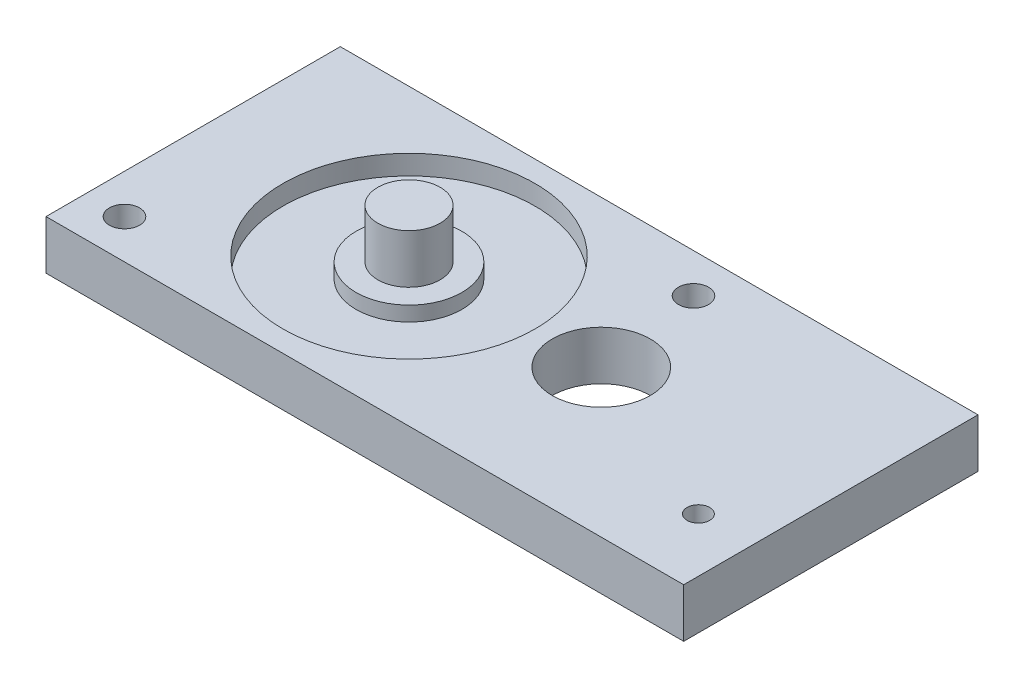
ISO-10303-21;
HEADER;
FILE_DESCRIPTION(('STEP AP214'),'2;1');
FILE_NAME('part.step','',(''),(''),'','','');
FILE_SCHEMA(('AUTOMOTIVE_DESIGN { 1 0 10303 214 1 1 1 1 }'));
ENDSEC;
DATA;
#1=APPLICATION_CONTEXT('core data for automotive mechanical design processes');
#2=APPLICATION_PROTOCOL_DEFINITION('international standard','automotive_design',2000,#1);
#3=PRODUCT_CONTEXT('',#1,'mechanical');
#4=PRODUCT('Part','Part','',(#3));
#5=PRODUCT_RELATED_PRODUCT_CATEGORY('part','',(#4));
#6=PRODUCT_DEFINITION_FORMATION('','',#4);
#7=PRODUCT_DEFINITION_CONTEXT('part definition',#1,'design');
#8=PRODUCT_DEFINITION('design','',#6,#7);
#9=PRODUCT_DEFINITION_SHAPE('','',#8);
#10=(LENGTH_UNIT() NAMED_UNIT(*) SI_UNIT(.MILLI.,.METRE.));
#11=(NAMED_UNIT(*) PLANE_ANGLE_UNIT() SI_UNIT($,.RADIAN.));
#12=(NAMED_UNIT(*) SI_UNIT($,.STERADIAN.) SOLID_ANGLE_UNIT());
#13=UNCERTAINTY_MEASURE_WITH_UNIT(LENGTH_MEASURE(1.E-05),#10,'distance_accuracy_value','');
#14=(GEOMETRIC_REPRESENTATION_CONTEXT(3) GLOBAL_UNCERTAINTY_ASSIGNED_CONTEXT((#13)) GLOBAL_UNIT_ASSIGNED_CONTEXT((#10,
#11,#12)) REPRESENTATION_CONTEXT('',''));
#15=CARTESIAN_POINT('',(0.,0.,0.));
#16=DIRECTION('',(0.,0.,1.));
#17=DIRECTION('',(1.,0.,0.));
#18=AXIS2_PLACEMENT_3D('',#15,#16,#17);
#19=CARTESIAN_POINT('',(0.,3.,0.));
#20=DIRECTION('',(0.,1.,0.));
#21=DIRECTION('',(0.,0.,1.));
#22=AXIS2_PLACEMENT_3D('',#19,#20,#21);
#23=CYLINDRICAL_SURFACE('',#22,5.4);
#24=CARTESIAN_POINT('',(0.,3.,0.));
#25=DIRECTION('',(0.,1.,0.));
#26=DIRECTION('',(0.,0.,1.));
#27=AXIS2_PLACEMENT_3D('',#24,#25,#26);
#28=CIRCLE('',#27,5.4);
#29=CARTESIAN_POINT('',(0.,3.,5.4));
#30=VERTEX_POINT('',#29);
#31=EDGE_CURVE('E120',#30,#30,#28,.T.);
#32=ORIENTED_EDGE('',*,*,#31,.T.);
#33=EDGE_LOOP('',(#32));
#34=FACE_BOUND('',#33,.T.);
#35=CARTESIAN_POINT('',(0.,4.5,0.));
#36=DIRECTION('',(0.,1.,0.));
#37=DIRECTION('',(0.,0.,1.));
#38=AXIS2_PLACEMENT_3D('',#35,#36,#37);
#39=CIRCLE('',#38,5.4);
#40=CARTESIAN_POINT('',(0.,4.5,5.4));
#41=VERTEX_POINT('',#40);
#42=EDGE_CURVE('E105',#41,#41,#39,.T.);
#43=ORIENTED_EDGE('',*,*,#42,.F.);
#44=EDGE_LOOP('',(#43));
#45=FACE_BOUND('',#44,.T.);
#46=ADVANCED_FACE('F38',(#34,#45),#23,.T.);
#47=CARTESIAN_POINT('',(-22.,5.,-15.));
#48=DIRECTION('',(1.,0.,0.));
#49=DIRECTION('',(0.,0.,-1.));
#50=AXIS2_PLACEMENT_3D('',#47,#48,#49);
#51=PLANE('',#50);
#52=DIRECTION('',(0.,0.,1.));
#53=VECTOR('',#52,1.);
#54=CARTESIAN_POINT('',(-22.,0.,-15.));
#55=LINE('',#54,#53);
#56=CARTESIAN_POINT('',(-22.,0.,-15.));
#57=VERTEX_POINT('',#56);
#58=CARTESIAN_POINT('',(-22.,0.,15.));
#59=VERTEX_POINT('',#58);
#60=EDGE_CURVE('E152',#57,#59,#55,.T.);
#61=ORIENTED_EDGE('',*,*,#60,.T.);
#62=DIRECTION('',(0.,-1.,0.));
#63=VECTOR('',#62,1.);
#64=CARTESIAN_POINT('',(-22.,5.,15.));
#65=LINE('',#64,#63);
#66=CARTESIAN_POINT('',(-22.,5.,15.));
#67=VERTEX_POINT('',#66);
#68=EDGE_CURVE('E11',#67,#59,#65,.T.);
#69=ORIENTED_EDGE('',*,*,#68,.F.);
#70=DIRECTION('',(0.,0.,1.));
#71=VECTOR('',#70,1.);
#72=CARTESIAN_POINT('',(-22.,5.,-15.));
#73=LINE('',#72,#71);
#74=CARTESIAN_POINT('',(-22.,5.,-15.));
#75=VERTEX_POINT('',#74);
#76=EDGE_CURVE('E153',#75,#67,#73,.T.);
#77=ORIENTED_EDGE('',*,*,#76,.F.);
#78=DIRECTION('',(0.,-1.,0.));
#79=VECTOR('',#78,1.);
#80=CARTESIAN_POINT('',(-22.,5.,-15.));
#81=LINE('',#80,#79);
#82=EDGE_CURVE('E49',#75,#57,#81,.T.);
#83=ORIENTED_EDGE('',*,*,#82,.T.);
#84=EDGE_LOOP('',(#61,#69,#77,#83));
#85=FACE_BOUND('',#84,.T.);
#86=ADVANCED_FACE('F40',(#85),#51,.F.);
#87=CARTESIAN_POINT('',(-22.,5.,15.));
#88=DIRECTION('',(0.,0.,-1.));
#89=DIRECTION('',(-1.,0.,0.));
#90=AXIS2_PLACEMENT_3D('',#87,#88,#89);
#91=PLANE('',#90);
#92=DIRECTION('',(1.,0.,0.));
#93=VECTOR('',#92,1.);
#94=CARTESIAN_POINT('',(-22.,0.,15.));
#95=LINE('',#94,#93);
#96=CARTESIAN_POINT('',(43.,0.,15.));
#97=VERTEX_POINT('',#96);
#98=EDGE_CURVE('E70',#59,#97,#95,.T.);
#99=ORIENTED_EDGE('',*,*,#98,.T.);
#100=DIRECTION('',(0.,1.,0.));
#101=VECTOR('',#100,1.);
#102=CARTESIAN_POINT('',(43.,0.,15.));
#103=LINE('',#102,#101);
#104=CARTESIAN_POINT('',(43.,5.,15.));
#105=VERTEX_POINT('',#104);
#106=EDGE_CURVE('E100',#97,#105,#103,.T.);
#107=ORIENTED_EDGE('',*,*,#106,.T.);
#108=DIRECTION('',(1.,0.,0.));
#109=VECTOR('',#108,1.);
#110=CARTESIAN_POINT('',(-22.,5.,15.));
#111=LINE('',#110,#109);
#112=EDGE_CURVE('E90',#67,#105,#111,.T.);
#113=ORIENTED_EDGE('',*,*,#112,.F.);
#114=ORIENTED_EDGE('',*,*,#68,.T.);
#115=EDGE_LOOP('',(#99,#107,#113,#114));
#116=FACE_BOUND('',#115,.T.);
#117=ADVANCED_FACE('F196',(#116),#91,.F.);
#118=CARTESIAN_POINT('',(-22.,5.,-15.));
#119=DIRECTION('',(0.,0.,1.));
#120=DIRECTION('',(1.,0.,0.));
#121=AXIS2_PLACEMENT_3D('',#118,#119,#120);
#122=PLANE('',#121);
#123=DIRECTION('',(-1.,0.,0.));
#124=VECTOR('',#123,1.);
#125=CARTESIAN_POINT('',(-22.,0.,-15.));
#126=LINE('',#125,#124);
#127=CARTESIAN_POINT('',(43.,0.,-15.));
#128=VERTEX_POINT('',#127);
#129=EDGE_CURVE('E75',#128,#57,#126,.T.);
#130=ORIENTED_EDGE('',*,*,#129,.T.);
#131=ORIENTED_EDGE('',*,*,#82,.F.);
#132=DIRECTION('',(-1.,0.,0.));
#133=VECTOR('',#132,1.);
#134=CARTESIAN_POINT('',(-22.,5.,-15.));
#135=LINE('',#134,#133);
#136=CARTESIAN_POINT('',(43.,5.,-15.));
#137=VERTEX_POINT('',#136);
#138=EDGE_CURVE('E58',#137,#75,#135,.T.);
#139=ORIENTED_EDGE('',*,*,#138,.F.);
#140=DIRECTION('',(0.,1.,0.));
#141=VECTOR('',#140,1.);
#142=CARTESIAN_POINT('',(43.,0.,-15.));
#143=LINE('',#142,#141);
#144=EDGE_CURVE('E85',#128,#137,#143,.T.);
#145=ORIENTED_EDGE('',*,*,#144,.F.);
#146=EDGE_LOOP('',(#130,#131,#139,#145));
#147=FACE_BOUND('',#146,.T.);
#148=ADVANCED_FACE('F84',(#147),#122,.F.);
#149=CARTESIAN_POINT('',(0.,5.,0.));
#150=DIRECTION('',(0.,1.,0.));
#151=DIRECTION('',(0.,0.,1.));
#152=AXIS2_PLACEMENT_3D('',#149,#150,#151);
#153=PLANE('',#152);
#154=CARTESIAN_POINT('',(37.5,5.,8.));
#155=DIRECTION('',(0.,1.,0.));
#156=DIRECTION('',(0.,0.,1.));
#157=AXIS2_PLACEMENT_3D('',#154,#155,#156);
#158=CIRCLE('',#157,1.15);
#159=CARTESIAN_POINT('',(37.5,5.,9.15));
#160=VERTEX_POINT('',#159);
#161=EDGE_CURVE('E338',#160,#160,#158,.T.);
#162=ORIENTED_EDGE('',*,*,#161,.F.);
#163=EDGE_LOOP('',(#162));
#164=FACE_BOUND('',#163,.T.);
#165=CARTESIAN_POINT('',(19.6,5.,0.));
#166=DIRECTION('',(0.,1.,0.));
#167=DIRECTION('',(0.,0.,1.));
#168=AXIS2_PLACEMENT_3D('',#165,#166,#167);
#169=CIRCLE('',#168,5.);
#170=CARTESIAN_POINT('',(19.6,5.,5.));
#171=VERTEX_POINT('',#170);
#172=EDGE_CURVE('E99',#171,#171,#169,.T.);
#173=ORIENTED_EDGE('',*,*,#172,.F.);
#174=EDGE_LOOP('',(#173));
#175=FACE_BOUND('',#174,.T.);
#176=CARTESIAN_POINT('',(0.,5.,0.));
#177=DIRECTION('',(0.,1.,0.));
#178=DIRECTION('',(0.,0.,1.));
#179=AXIS2_PLACEMENT_3D('',#176,#177,#178);
#180=CIRCLE('',#179,12.85);
#181=CARTESIAN_POINT('',(0.,5.,12.85));
#182=VERTEX_POINT('',#181);
#183=EDGE_CURVE('E124',#182,#182,#180,.T.);
#184=ORIENTED_EDGE('',*,*,#183,.F.);
#185=EDGE_LOOP('',(#184));
#186=FACE_BOUND('',#185,.T.);
#187=CARTESIAN_POINT('',(-18.,5.,11.));
#188=DIRECTION('',(0.,1.,0.));
#189=DIRECTION('',(0.,0.,1.));
#190=AXIS2_PLACEMENT_3D('',#187,#188,#189);
#191=CIRCLE('',#190,1.5367);
#192=CARTESIAN_POINT('',(-18.,5.,12.5367));
#193=VERTEX_POINT('',#192);
#194=EDGE_CURVE('E138',#193,#193,#191,.T.);
#195=ORIENTED_EDGE('',*,*,#194,.F.);
#196=EDGE_LOOP('',(#195));
#197=FACE_BOUND('',#196,.T.);
#198=CARTESIAN_POINT('',(18.,5.,-11.));
#199=DIRECTION('',(0.,1.,0.));
#200=DIRECTION('',(0.,0.,1.));
#201=AXIS2_PLACEMENT_3D('',#198,#199,#200);
#202=CIRCLE('',#201,1.5367);
#203=CARTESIAN_POINT('',(18.,5.,-9.4633));
#204=VERTEX_POINT('',#203);
#205=EDGE_CURVE('E129',#204,#204,#202,.T.);
#206=ORIENTED_EDGE('',*,*,#205,.F.);
#207=EDGE_LOOP('',(#206));
#208=FACE_BOUND('',#207,.T.);
#209=ORIENTED_EDGE('',*,*,#76,.T.);
#210=ORIENTED_EDGE('',*,*,#112,.T.);
#211=DIRECTION('',(0.,0.,-1.));
#212=VECTOR('',#211,1.);
#213=CARTESIAN_POINT('',(43.,5.,-15.));
#214=LINE('',#213,#212);
#215=EDGE_CURVE('E96',#105,#137,#214,.T.);
#216=ORIENTED_EDGE('',*,*,#215,.T.);
#217=ORIENTED_EDGE('',*,*,#138,.T.);
#218=EDGE_LOOP('',(#209,#210,#216,#217));
#219=FACE_BOUND('',#218,.T.);
#220=ADVANCED_FACE('F102',(#164,#175,#186,#197,#208,#219),#153,.T.);
#221=CARTESIAN_POINT('',(0.,0.,0.));
#222=DIRECTION('',(0.,1.,0.));
#223=DIRECTION('',(0.,0.,1.));
#224=AXIS2_PLACEMENT_3D('',#221,#222,#223);
#225=PLANE('',#224);
#226=CARTESIAN_POINT('',(37.5,0.,8.));
#227=DIRECTION('',(0.,1.,0.));
#228=DIRECTION('',(0.,0.,1.));
#229=AXIS2_PLACEMENT_3D('',#226,#227,#228);
#230=CIRCLE('',#229,1.15);
#231=CARTESIAN_POINT('',(37.5,0.,9.15));
#232=VERTEX_POINT('',#231);
#233=EDGE_CURVE('E42',#232,#232,#230,.T.);
#234=ORIENTED_EDGE('',*,*,#233,.T.);
#235=EDGE_LOOP('',(#234));
#236=FACE_BOUND('',#235,.T.);
#237=CARTESIAN_POINT('',(19.6,0.,0.));
#238=DIRECTION('',(0.,1.,0.));
#239=DIRECTION('',(0.,0.,1.));
#240=AXIS2_PLACEMENT_3D('',#237,#238,#239);
#241=CIRCLE('',#240,5.);
#242=CARTESIAN_POINT('',(19.6,0.,5.));
#243=VERTEX_POINT('',#242);
#244=EDGE_CURVE('E119',#243,#243,#241,.T.);
#245=ORIENTED_EDGE('',*,*,#244,.T.);
#246=EDGE_LOOP('',(#245));
#247=FACE_BOUND('',#246,.T.);
#248=CARTESIAN_POINT('',(-18.,0.,11.));
#249=DIRECTION('',(0.,1.,0.));
#250=DIRECTION('',(0.,0.,1.));
#251=AXIS2_PLACEMENT_3D('',#248,#249,#250);
#252=CIRCLE('',#251,1.5367);
#253=CARTESIAN_POINT('',(-18.,0.,12.5367));
#254=VERTEX_POINT('',#253);
#255=EDGE_CURVE('E133',#254,#254,#252,.T.);
#256=ORIENTED_EDGE('',*,*,#255,.T.);
#257=EDGE_LOOP('',(#256));
#258=FACE_BOUND('',#257,.T.);
#259=CARTESIAN_POINT('',(18.,0.,-11.));
#260=DIRECTION('',(0.,1.,0.));
#261=DIRECTION('',(0.,0.,1.));
#262=AXIS2_PLACEMENT_3D('',#259,#260,#261);
#263=CIRCLE('',#262,1.5367);
#264=CARTESIAN_POINT('',(18.,0.,-9.4633));
#265=VERTEX_POINT('',#264);
#266=EDGE_CURVE('E142',#265,#265,#263,.T.);
#267=ORIENTED_EDGE('',*,*,#266,.T.);
#268=EDGE_LOOP('',(#267));
#269=FACE_BOUND('',#268,.T.);
#270=ORIENTED_EDGE('',*,*,#60,.F.);
#271=ORIENTED_EDGE('',*,*,#129,.F.);
#272=DIRECTION('',(0.,0.,-1.));
#273=VECTOR('',#272,1.);
#274=CARTESIAN_POINT('',(43.,0.,-15.));
#275=LINE('',#274,#273);
#276=EDGE_CURVE('E97',#97,#128,#275,.T.);
#277=ORIENTED_EDGE('',*,*,#276,.F.);
#278=ORIENTED_EDGE('',*,*,#98,.F.);
#279=EDGE_LOOP('',(#270,#271,#277,#278));
#280=FACE_BOUND('',#279,.T.);
#281=ADVANCED_FACE('F170',(#236,#247,#258,#269,#280),#225,.F.);
#282=CARTESIAN_POINT('',(18.,0.,-11.));
#283=DIRECTION('',(0.,1.,0.));
#284=DIRECTION('',(0.,0.,1.));
#285=AXIS2_PLACEMENT_3D('',#282,#283,#284);
#286=CYLINDRICAL_SURFACE('',#285,1.5367);
#287=ORIENTED_EDGE('',*,*,#266,.F.);
#288=EDGE_LOOP('',(#287));
#289=FACE_BOUND('',#288,.T.);
#290=ORIENTED_EDGE('',*,*,#205,.T.);
#291=EDGE_LOOP('',(#290));
#292=FACE_BOUND('',#291,.T.);
#293=ADVANCED_FACE('F206',(#289,#292),#286,.F.);
#294=CARTESIAN_POINT('',(-18.,0.,11.));
#295=DIRECTION('',(0.,1.,0.));
#296=DIRECTION('',(0.,0.,1.));
#297=AXIS2_PLACEMENT_3D('',#294,#295,#296);
#298=CYLINDRICAL_SURFACE('',#297,1.5367);
#299=ORIENTED_EDGE('',*,*,#255,.F.);
#300=EDGE_LOOP('',(#299));
#301=FACE_BOUND('',#300,.T.);
#302=ORIENTED_EDGE('',*,*,#194,.T.);
#303=EDGE_LOOP('',(#302));
#304=FACE_BOUND('',#303,.T.);
#305=ADVANCED_FACE('F202',(#301,#304),#298,.F.);
#306=CARTESIAN_POINT('',(0.,3.,0.));
#307=DIRECTION('',(0.,1.,0.));
#308=DIRECTION('',(0.,0.,1.));
#309=AXIS2_PLACEMENT_3D('',#306,#307,#308);
#310=CYLINDRICAL_SURFACE('',#309,12.85);
#311=CARTESIAN_POINT('',(0.,3.,0.));
#312=DIRECTION('',(0.,1.,0.));
#313=DIRECTION('',(0.,0.,1.));
#314=AXIS2_PLACEMENT_3D('',#311,#312,#313);
#315=CIRCLE('',#314,12.85);
#316=CARTESIAN_POINT('',(0.,3.,12.85));
#317=VERTEX_POINT('',#316);
#318=EDGE_CURVE('E125',#317,#317,#315,.T.);
#319=ORIENTED_EDGE('',*,*,#318,.F.);
#320=EDGE_LOOP('',(#319));
#321=FACE_BOUND('',#320,.T.);
#322=ORIENTED_EDGE('',*,*,#183,.T.);
#323=EDGE_LOOP('',(#322));
#324=FACE_BOUND('',#323,.T.);
#325=ADVANCED_FACE('F185',(#321,#324),#310,.F.);
#326=CARTESIAN_POINT('',(0.,3.,0.));
#327=DIRECTION('',(0.,1.,0.));
#328=DIRECTION('',(0.,0.,1.));
#329=AXIS2_PLACEMENT_3D('',#326,#327,#328);
#330=PLANE('',#329);
#331=ORIENTED_EDGE('',*,*,#31,.F.);
#332=EDGE_LOOP('',(#331));
#333=FACE_BOUND('',#332,.T.);
#334=ORIENTED_EDGE('',*,*,#318,.T.);
#335=EDGE_LOOP('',(#334));
#336=FACE_BOUND('',#335,.T.);
#337=ADVANCED_FACE('F175',(#333,#336),#330,.T.);
#338=CARTESIAN_POINT('',(19.6,-5.,0.));
#339=DIRECTION('',(0.,1.,0.));
#340=DIRECTION('',(0.,0.,1.));
#341=AXIS2_PLACEMENT_3D('',#338,#339,#340);
#342=CYLINDRICAL_SURFACE('',#341,5.);
#343=ORIENTED_EDGE('',*,*,#172,.T.);
#344=EDGE_LOOP('',(#343));
#345=FACE_BOUND('',#344,.T.);
#346=ORIENTED_EDGE('',*,*,#244,.F.);
#347=EDGE_LOOP('',(#346));
#348=FACE_BOUND('',#347,.T.);
#349=ADVANCED_FACE('F173',(#345,#348),#342,.F.);
#350=CARTESIAN_POINT('',(43.,0.,-15.));
#351=DIRECTION('',(1.,0.,0.));
#352=DIRECTION('',(0.,0.,-1.));
#353=AXIS2_PLACEMENT_3D('',#350,#351,#352);
#354=PLANE('',#353);
#355=ORIENTED_EDGE('',*,*,#215,.F.);
#356=ORIENTED_EDGE('',*,*,#106,.F.);
#357=ORIENTED_EDGE('',*,*,#276,.T.);
#358=ORIENTED_EDGE('',*,*,#144,.T.);
#359=EDGE_LOOP('',(#355,#356,#357,#358));
#360=FACE_BOUND('',#359,.T.);
#361=ADVANCED_FACE('F94',(#360),#354,.T.);
#362=CARTESIAN_POINT('',(0.,4.5,0.));
#363=DIRECTION('',(0.,1.,0.));
#364=DIRECTION('',(0.,0.,1.));
#365=AXIS2_PLACEMENT_3D('',#362,#363,#364);
#366=PLANE('',#365);
#367=CARTESIAN_POINT('',(0.,4.5,0.));
#368=DIRECTION('',(0.,1.,0.));
#369=DIRECTION('',(0.,0.,1.));
#370=AXIS2_PLACEMENT_3D('',#367,#368,#369);
#371=CIRCLE('',#370,3.175);
#372=CARTESIAN_POINT('',(0.,4.5,3.175));
#373=VERTEX_POINT('',#372);
#374=EDGE_CURVE('E111',#373,#373,#371,.T.);
#375=ORIENTED_EDGE('',*,*,#374,.F.);
#376=EDGE_LOOP('',(#375));
#377=FACE_BOUND('',#376,.T.);
#378=ORIENTED_EDGE('',*,*,#42,.T.);
#379=EDGE_LOOP('',(#378));
#380=FACE_BOUND('',#379,.T.);
#381=ADVANCED_FACE('F182',(#377,#380),#366,.T.);
#382=CARTESIAN_POINT('',(0.,9.5,0.));
#383=DIRECTION('',(0.,1.,0.));
#384=DIRECTION('',(0.,0.,1.));
#385=AXIS2_PLACEMENT_3D('',#382,#383,#384);
#386=PLANE('',#385);
#387=CARTESIAN_POINT('',(0.,9.5,0.));
#388=DIRECTION('',(0.,1.,0.));
#389=DIRECTION('',(0.,0.,1.));
#390=AXIS2_PLACEMENT_3D('',#387,#388,#389);
#391=CIRCLE('',#390,3.175);
#392=CARTESIAN_POINT('',(0.,9.5,3.175));
#393=VERTEX_POINT('',#392);
#394=EDGE_CURVE('E137',#393,#393,#391,.T.);
#395=ORIENTED_EDGE('',*,*,#394,.T.);
#396=EDGE_LOOP('',(#395));
#397=FACE_BOUND('',#396,.T.);
#398=ADVANCED_FACE('F211',(#397),#386,.T.);
#399=CARTESIAN_POINT('',(0.,9.5,0.));
#400=DIRECTION('',(0.,-1.,0.));
#401=DIRECTION('',(0.,0.,-1.));
#402=AXIS2_PLACEMENT_3D('',#399,#400,#401);
#403=CYLINDRICAL_SURFACE('',#402,3.175);
#404=ORIENTED_EDGE('',*,*,#394,.F.);
#405=EDGE_LOOP('',(#404));
#406=FACE_BOUND('',#405,.T.);
#407=ORIENTED_EDGE('',*,*,#374,.T.);
#408=EDGE_LOOP('',(#407));
#409=FACE_BOUND('',#408,.T.);
#410=ADVANCED_FACE('F213',(#406,#409),#403,.T.);
#411=CARTESIAN_POINT('',(37.5,-10.,8.));
#412=DIRECTION('',(0.,1.,0.));
#413=DIRECTION('',(0.,0.,1.));
#414=AXIS2_PLACEMENT_3D('',#411,#412,#413);
#415=CYLINDRICAL_SURFACE('',#414,1.15);
#416=ORIENTED_EDGE('',*,*,#161,.T.);
#417=EDGE_LOOP('',(#416));
#418=FACE_BOUND('',#417,.T.);
#419=ORIENTED_EDGE('',*,*,#233,.F.);
#420=EDGE_LOOP('',(#419));
#421=FACE_BOUND('',#420,.T.);
#422=ADVANCED_FACE('F217',(#418,#421),#415,.F.);
#423=CLOSED_SHELL('',(#46,#86,#117,#148,#220,#281,#293,#305,#325,#337,#349,#361,#381,#398,#410,#422));
#424=MANIFOLD_SOLID_BREP('B2',#423);
#425=ADVANCED_BREP_SHAPE_REPRESENTATION('',(#18,#424),#14);
#426=SHAPE_DEFINITION_REPRESENTATION(#9,#425);
ENDSEC;
END-ISO-10303-21;
